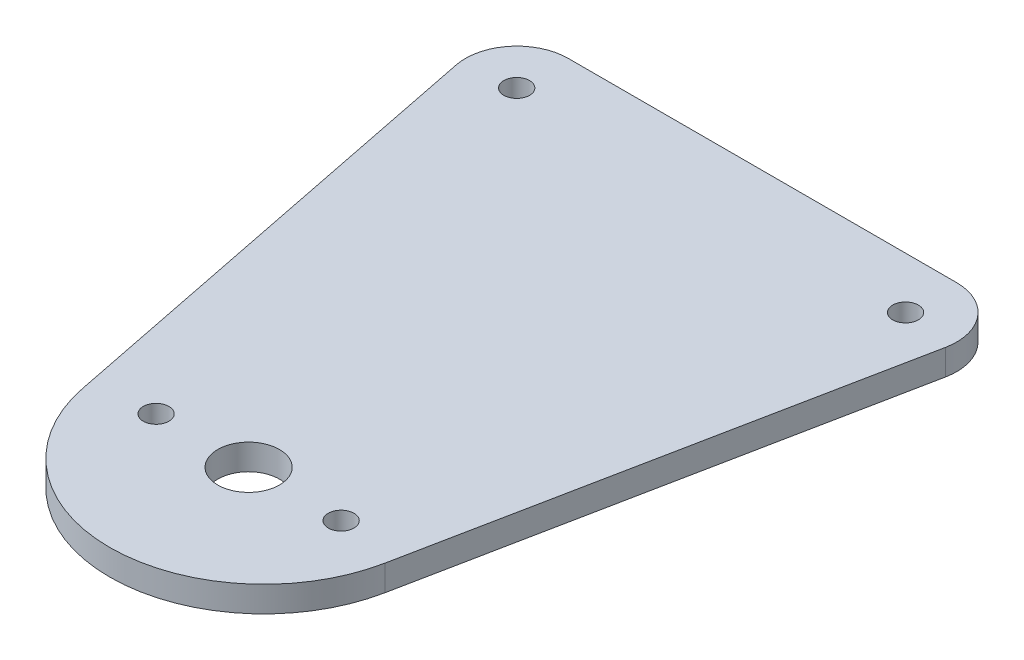
ISO-10303-21;
HEADER;
FILE_DESCRIPTION(('STEP AP214'),'2;1');
FILE_NAME('part.step','',(''),(''),'','','');
FILE_SCHEMA(('AUTOMOTIVE_DESIGN { 1 0 10303 214 1 1 1 1 }'));
ENDSEC;
DATA;
#1=APPLICATION_CONTEXT('core data for automotive mechanical design processes');
#2=APPLICATION_PROTOCOL_DEFINITION('international standard','automotive_design',2000,#1);
#3=PRODUCT_CONTEXT('',#1,'mechanical');
#4=PRODUCT('Part','Part','',(#3));
#5=PRODUCT_RELATED_PRODUCT_CATEGORY('part','',(#4));
#6=PRODUCT_DEFINITION_FORMATION('','',#4);
#7=PRODUCT_DEFINITION_CONTEXT('part definition',#1,'design');
#8=PRODUCT_DEFINITION('design','',#6,#7);
#9=PRODUCT_DEFINITION_SHAPE('','',#8);
#10=(LENGTH_UNIT() NAMED_UNIT(*) SI_UNIT(.MILLI.,.METRE.));
#11=(NAMED_UNIT(*) PLANE_ANGLE_UNIT() SI_UNIT($,.RADIAN.));
#12=(NAMED_UNIT(*) SI_UNIT($,.STERADIAN.) SOLID_ANGLE_UNIT());
#13=UNCERTAINTY_MEASURE_WITH_UNIT(LENGTH_MEASURE(1.E-05),#10,'distance_accuracy_value','');
#14=(GEOMETRIC_REPRESENTATION_CONTEXT(3) GLOBAL_UNCERTAINTY_ASSIGNED_CONTEXT((#13)) GLOBAL_UNIT_ASSIGNED_CONTEXT((#10,
#11,#12)) REPRESENTATION_CONTEXT('',''));
#15=CARTESIAN_POINT('',(0.,0.,0.));
#16=DIRECTION('',(0.,0.,1.));
#17=DIRECTION('',(1.,0.,0.));
#18=AXIS2_PLACEMENT_3D('',#15,#16,#17);
#19=CARTESIAN_POINT('',(-12.17,5.,-81.8380988672649));
#20=DIRECTION('',(0.,1.,0.));
#21=DIRECTION('',(0.,0.,1.));
#22=AXIS2_PLACEMENT_3D('',#19,#20,#21);
#23=PLANE('',#22);
#24=CARTESIAN_POINT('',(25.66,5.,-168.867513459481));
#25=DIRECTION('',(0.,1.,0.));
#26=DIRECTION('',(0.,0.,-1.));
#27=AXIS2_PLACEMENT_3D('',#24,#25,#26);
#28=CIRCLE('',#27,2.50000000000002);
#29=CARTESIAN_POINT('',(25.66,5.,-171.367513459481));
#30=VERTEX_POINT('',#29);
#31=EDGE_CURVE('E195',#30,#30,#28,.T.);
#32=ORIENTED_EDGE('',*,*,#31,.F.);
#33=EDGE_LOOP('',(#32));
#34=FACE_BOUND('',#33,.T.);
#35=CARTESIAN_POINT('',(5.82999999999994,5.,-78.8675134594814));
#36=DIRECTION('',(0.,1.,0.));
#37=DIRECTION('',(0.,0.,-1.));
#38=AXIS2_PLACEMENT_3D('',#35,#36,#37);
#39=CIRCLE('',#38,2.5);
#40=CARTESIAN_POINT('',(5.82999999999994,5.,-81.3675134594814));
#41=VERTEX_POINT('',#40);
#42=EDGE_CURVE('E207',#41,#41,#39,.T.);
#43=ORIENTED_EDGE('',*,*,#42,.F.);
#44=EDGE_LOOP('',(#43));
#45=FACE_BOUND('',#44,.T.);
#46=CARTESIAN_POINT('',(-12.17,5.,-81.8380988672649));
#47=DIRECTION('',(0.,1.,0.));
#48=DIRECTION('',(0.,0.,1.));
#49=AXIS2_PLACEMENT_3D('',#46,#47,#48);
#50=CIRCLE('',#49,30.);
#51=CARTESIAN_POINT('',(-41.5874202707276,5.,-75.9546148131194));
#52=VERTEX_POINT('',#51);
#53=CARTESIAN_POINT('',(17.2474202707275,5.,-75.9546148131194));
#54=VERTEX_POINT('',#53);
#55=EDGE_CURVE('E131',#52,#54,#50,.T.);
#56=ORIENTED_EDGE('',*,*,#55,.T.);
#57=DIRECTION('',(0.196116135138184,0.,-0.98058067569092));
#58=VECTOR('',#57,1.);
#59=CARTESIAN_POINT('',(17.2474202707275,5.,-75.9546148131194));
#60=LINE('',#59,#58);
#61=CARTESIAN_POINT('',(35.4377677297236,5.,-166.9063521081));
#62=VERTEX_POINT('',#61);
#63=EDGE_CURVE('E89',#54,#62,#60,.T.);
#64=ORIENTED_EDGE('',*,*,#63,.T.);
#65=CARTESIAN_POINT('',(25.6319609728144,5.,-168.867513459481));
#66=DIRECTION('',(0.,1.,0.));
#67=DIRECTION('',(0.,0.,-1.));
#68=AXIS2_PLACEMENT_3D('',#65,#66,#67);
#69=CIRCLE('',#68,9.99999999999999);
#70=CARTESIAN_POINT('',(25.6319609728144,5.,-178.867513459481));
#71=VERTEX_POINT('',#70);
#72=EDGE_CURVE('E102',#62,#71,#69,.T.);
#73=ORIENTED_EDGE('',*,*,#72,.T.);
#74=DIRECTION('',(-1.,0.,0.));
#75=VECTOR('',#74,1.);
#76=CARTESIAN_POINT('',(25.6319609728144,5.,-178.867513459481));
#77=LINE('',#76,#75);
#78=CARTESIAN_POINT('',(-49.9719609728145,5.,-178.867513459481));
#79=VERTEX_POINT('',#78);
#80=EDGE_CURVE('E96',#71,#79,#77,.T.);
#81=ORIENTED_EDGE('',*,*,#80,.T.);
#82=CARTESIAN_POINT('',(-49.9719609728145,5.,-168.867513459481));
#83=DIRECTION('',(0.,1.,0.));
#84=DIRECTION('',(0.,0.,1.));
#85=AXIS2_PLACEMENT_3D('',#82,#83,#84);
#86=CIRCLE('',#85,10.);
#87=CARTESIAN_POINT('',(-59.7777677297237,5.,-166.9063521081));
#88=VERTEX_POINT('',#87);
#89=EDGE_CURVE('E100',#79,#88,#86,.T.);
#90=ORIENTED_EDGE('',*,*,#89,.T.);
#91=DIRECTION('',(0.196116135138184,0.,0.98058067569092));
#92=VECTOR('',#91,1.);
#93=CARTESIAN_POINT('',(-59.7777677297237,5.,-166.9063521081));
#94=LINE('',#93,#92);
#95=EDGE_CURVE('E52',#88,#52,#94,.T.);
#96=ORIENTED_EDGE('',*,*,#95,.T.);
#97=EDGE_LOOP('',(#56,#64,#73,#81,#90,#96));
#98=FACE_BOUND('',#97,.T.);
#99=CARTESIAN_POINT('',(-30.1700000000001,5.,-78.8675134594814));
#100=DIRECTION('',(0.,1.,0.));
#101=DIRECTION('',(0.,0.,1.));
#102=AXIS2_PLACEMENT_3D('',#99,#100,#101);
#103=CIRCLE('',#102,2.5);
#104=CARTESIAN_POINT('',(-30.1700000000001,5.,-76.3675134594814));
#105=VERTEX_POINT('',#104);
#106=EDGE_CURVE('E124',#105,#105,#103,.T.);
#107=ORIENTED_EDGE('',*,*,#106,.F.);
#108=EDGE_LOOP('',(#107));
#109=FACE_BOUND('',#108,.T.);
#110=CARTESIAN_POINT('',(-50.0000000000001,5.,-168.867513459481));
#111=DIRECTION('',(0.,1.,0.));
#112=DIRECTION('',(0.,0.,1.));
#113=AXIS2_PLACEMENT_3D('',#110,#111,#112);
#114=CIRCLE('',#113,2.5);
#115=CARTESIAN_POINT('',(-50.0000000000001,5.,-166.367513459481));
#116=VERTEX_POINT('',#115);
#117=EDGE_CURVE('E201',#116,#116,#114,.T.);
#118=ORIENTED_EDGE('',*,*,#117,.F.);
#119=EDGE_LOOP('',(#118));
#120=FACE_BOUND('',#119,.T.);
#121=CARTESIAN_POINT('',(-12.17,5.,-78.8675134594814));
#122=DIRECTION('',(0.,1.,0.));
#123=DIRECTION('',(0.,0.,1.));
#124=AXIS2_PLACEMENT_3D('',#121,#122,#123);
#125=CIRCLE('',#124,6.);
#126=CARTESIAN_POINT('',(-12.17,5.,-72.8675134594814));
#127=VERTEX_POINT('',#126);
#128=EDGE_CURVE('E186',#127,#127,#125,.T.);
#129=ORIENTED_EDGE('',*,*,#128,.F.);
#130=EDGE_LOOP('',(#129));
#131=FACE_BOUND('',#130,.T.);
#132=ADVANCED_FACE('F35',(#34,#45,#98,#109,#120,#131),#23,.T.);
#133=CARTESIAN_POINT('',(-12.17,0.,-81.8380988672649));
#134=DIRECTION('',(0.,1.,0.));
#135=DIRECTION('',(0.,0.,1.));
#136=AXIS2_PLACEMENT_3D('',#133,#134,#135);
#137=PLANE('',#136);
#138=CARTESIAN_POINT('',(-12.17,0.,-81.8380988672649));
#139=DIRECTION('',(0.,1.,0.));
#140=DIRECTION('',(0.,0.,1.));
#141=AXIS2_PLACEMENT_3D('',#138,#139,#140);
#142=CIRCLE('',#141,30.);
#143=CARTESIAN_POINT('',(-41.5874202707276,0.,-75.9546148131194));
#144=VERTEX_POINT('',#143);
#145=CARTESIAN_POINT('',(17.2474202707275,0.,-75.9546148131194));
#146=VERTEX_POINT('',#145);
#147=EDGE_CURVE('E120',#144,#146,#142,.T.);
#148=ORIENTED_EDGE('',*,*,#147,.F.);
#149=DIRECTION('',(0.196116135138184,0.,0.98058067569092));
#150=VECTOR('',#149,1.);
#151=CARTESIAN_POINT('',(-59.7777677297237,0.,-166.9063521081));
#152=LINE('',#151,#150);
#153=CARTESIAN_POINT('',(-59.7777677297237,0.,-166.9063521081));
#154=VERTEX_POINT('',#153);
#155=EDGE_CURVE('E81',#154,#144,#152,.T.);
#156=ORIENTED_EDGE('',*,*,#155,.F.);
#157=CARTESIAN_POINT('',(-49.9719609728145,0.,-168.867513459481));
#158=DIRECTION('',(0.,1.,0.));
#159=DIRECTION('',(0.,0.,1.));
#160=AXIS2_PLACEMENT_3D('',#157,#158,#159);
#161=CIRCLE('',#160,10.);
#162=CARTESIAN_POINT('',(-49.9719609728145,0.,-178.867513459481));
#163=VERTEX_POINT('',#162);
#164=EDGE_CURVE('E75',#163,#154,#161,.T.);
#165=ORIENTED_EDGE('',*,*,#164,.F.);
#166=DIRECTION('',(-1.,0.,0.));
#167=VECTOR('',#166,1.);
#168=CARTESIAN_POINT('',(25.6319609728144,0.,-178.867513459481));
#169=LINE('',#168,#167);
#170=CARTESIAN_POINT('',(25.6319609728144,0.,-178.867513459481));
#171=VERTEX_POINT('',#170);
#172=EDGE_CURVE('E110',#171,#163,#169,.T.);
#173=ORIENTED_EDGE('',*,*,#172,.F.);
#174=CARTESIAN_POINT('',(25.6319609728144,0.,-168.867513459481));
#175=DIRECTION('',(0.,1.,0.));
#176=DIRECTION('',(0.,0.,-1.));
#177=AXIS2_PLACEMENT_3D('',#174,#175,#176);
#178=CIRCLE('',#177,9.99999999999999);
#179=CARTESIAN_POINT('',(35.4377677297236,0.,-166.9063521081));
#180=VERTEX_POINT('',#179);
#181=EDGE_CURVE('E126',#180,#171,#178,.T.);
#182=ORIENTED_EDGE('',*,*,#181,.F.);
#183=DIRECTION('',(0.196116135138184,0.,-0.98058067569092));
#184=VECTOR('',#183,1.);
#185=CARTESIAN_POINT('',(17.2474202707275,0.,-75.9546148131194));
#186=LINE('',#185,#184);
#187=EDGE_CURVE('E123',#146,#180,#186,.T.);
#188=ORIENTED_EDGE('',*,*,#187,.F.);
#189=EDGE_LOOP('',(#148,#156,#165,#173,#182,#188));
#190=FACE_BOUND('',#189,.T.);
#191=CARTESIAN_POINT('',(-30.1700000000001,0.,-78.8675134594814));
#192=DIRECTION('',(0.,1.,0.));
#193=DIRECTION('',(0.,0.,1.));
#194=AXIS2_PLACEMENT_3D('',#191,#192,#193);
#195=CIRCLE('',#194,2.5);
#196=CARTESIAN_POINT('',(-30.1700000000001,0.,-76.3675134594814));
#197=VERTEX_POINT('',#196);
#198=EDGE_CURVE('E210',#197,#197,#195,.T.);
#199=ORIENTED_EDGE('',*,*,#198,.T.);
#200=EDGE_LOOP('',(#199));
#201=FACE_BOUND('',#200,.T.);
#202=CARTESIAN_POINT('',(5.82999999999994,0.,-78.8675134594814));
#203=DIRECTION('',(0.,1.,0.));
#204=DIRECTION('',(0.,0.,-1.));
#205=AXIS2_PLACEMENT_3D('',#202,#203,#204);
#206=CIRCLE('',#205,2.5);
#207=CARTESIAN_POINT('',(5.82999999999994,0.,-81.3675134594814));
#208=VERTEX_POINT('',#207);
#209=EDGE_CURVE('E204',#208,#208,#206,.T.);
#210=ORIENTED_EDGE('',*,*,#209,.T.);
#211=EDGE_LOOP('',(#210));
#212=FACE_BOUND('',#211,.T.);
#213=CARTESIAN_POINT('',(-50.0000000000001,0.,-168.867513459481));
#214=DIRECTION('',(0.,1.,0.));
#215=DIRECTION('',(0.,0.,1.));
#216=AXIS2_PLACEMENT_3D('',#213,#214,#215);
#217=CIRCLE('',#216,2.5);
#218=CARTESIAN_POINT('',(-50.0000000000001,0.,-166.367513459481));
#219=VERTEX_POINT('',#218);
#220=EDGE_CURVE('E198',#219,#219,#217,.T.);
#221=ORIENTED_EDGE('',*,*,#220,.T.);
#222=EDGE_LOOP('',(#221));
#223=FACE_BOUND('',#222,.T.);
#224=CARTESIAN_POINT('',(25.66,0.,-168.867513459481));
#225=DIRECTION('',(0.,1.,0.));
#226=DIRECTION('',(0.,0.,-1.));
#227=AXIS2_PLACEMENT_3D('',#224,#225,#226);
#228=CIRCLE('',#227,2.50000000000002);
#229=CARTESIAN_POINT('',(25.66,0.,-171.367513459481));
#230=VERTEX_POINT('',#229);
#231=EDGE_CURVE('E192',#230,#230,#228,.T.);
#232=ORIENTED_EDGE('',*,*,#231,.T.);
#233=EDGE_LOOP('',(#232));
#234=FACE_BOUND('',#233,.T.);
#235=CARTESIAN_POINT('',(-12.17,0.,-78.8675134594814));
#236=DIRECTION('',(0.,1.,0.));
#237=DIRECTION('',(0.,0.,1.));
#238=AXIS2_PLACEMENT_3D('',#235,#236,#237);
#239=CIRCLE('',#238,6.);
#240=CARTESIAN_POINT('',(-12.17,0.,-72.8675134594814));
#241=VERTEX_POINT('',#240);
#242=EDGE_CURVE('E189',#241,#241,#239,.T.);
#243=ORIENTED_EDGE('',*,*,#242,.T.);
#244=EDGE_LOOP('',(#243));
#245=FACE_BOUND('',#244,.T.);
#246=ADVANCED_FACE('F140',(#190,#201,#212,#223,#234,#245),#137,.F.);
#247=CARTESIAN_POINT('',(-12.17,5.,-81.8380988672649));
#248=DIRECTION('',(0.,-1.,0.));
#249=DIRECTION('',(0.,0.,-1.));
#250=AXIS2_PLACEMENT_3D('',#247,#248,#249);
#251=CYLINDRICAL_SURFACE('',#250,30.);
#252=ORIENTED_EDGE('',*,*,#147,.T.);
#253=DIRECTION('',(0.,-1.,0.));
#254=VECTOR('',#253,1.);
#255=CARTESIAN_POINT('',(17.2474202707275,5.,-75.9546148131194));
#256=LINE('',#255,#254);
#257=EDGE_CURVE('E11',#54,#146,#256,.T.);
#258=ORIENTED_EDGE('',*,*,#257,.F.);
#259=ORIENTED_EDGE('',*,*,#55,.F.);
#260=DIRECTION('',(0.,-1.,0.));
#261=VECTOR('',#260,1.);
#262=CARTESIAN_POINT('',(-41.5874202707276,5.,-75.9546148131194));
#263=LINE('',#262,#261);
#264=EDGE_CURVE('E116',#52,#144,#263,.T.);
#265=ORIENTED_EDGE('',*,*,#264,.T.);
#266=EDGE_LOOP('',(#252,#258,#259,#265));
#267=FACE_BOUND('',#266,.T.);
#268=ADVANCED_FACE('F37',(#267),#251,.T.);
#269=CARTESIAN_POINT('',(17.2474202707275,5.,-75.9546148131194));
#270=DIRECTION('',(-0.98058067569092,0.,-0.196116135138184));
#271=DIRECTION('',(-0.196116135138184,0.,0.98058067569092));
#272=AXIS2_PLACEMENT_3D('',#269,#270,#271);
#273=PLANE('',#272);
#274=ORIENTED_EDGE('',*,*,#187,.T.);
#275=DIRECTION('',(0.,-1.,0.));
#276=VECTOR('',#275,1.);
#277=CARTESIAN_POINT('',(35.4377677297236,5.,-166.9063521081));
#278=LINE('',#277,#276);
#279=EDGE_CURVE('E44',#62,#180,#278,.T.);
#280=ORIENTED_EDGE('',*,*,#279,.F.);
#281=ORIENTED_EDGE('',*,*,#63,.F.);
#282=ORIENTED_EDGE('',*,*,#257,.T.);
#283=EDGE_LOOP('',(#274,#280,#281,#282));
#284=FACE_BOUND('',#283,.T.);
#285=ADVANCED_FACE('F277',(#284),#273,.F.);
#286=CARTESIAN_POINT('',(25.6319609728144,5.,-168.867513459481));
#287=DIRECTION('',(0.,-1.,0.));
#288=DIRECTION('',(0.,0.,-1.));
#289=AXIS2_PLACEMENT_3D('',#286,#287,#288);
#290=CYLINDRICAL_SURFACE('',#289,9.99999999999999);
#291=ORIENTED_EDGE('',*,*,#181,.T.);
#292=DIRECTION('',(0.,-1.,0.));
#293=VECTOR('',#292,1.);
#294=CARTESIAN_POINT('',(25.6319609728144,5.,-178.867513459481));
#295=LINE('',#294,#293);
#296=EDGE_CURVE('E111',#71,#171,#295,.T.);
#297=ORIENTED_EDGE('',*,*,#296,.F.);
#298=ORIENTED_EDGE('',*,*,#72,.F.);
#299=ORIENTED_EDGE('',*,*,#279,.T.);
#300=EDGE_LOOP('',(#291,#297,#298,#299));
#301=FACE_BOUND('',#300,.T.);
#302=ADVANCED_FACE('F137',(#301),#290,.T.);
#303=CARTESIAN_POINT('',(25.6319609728144,5.,-178.867513459481));
#304=DIRECTION('',(0.,0.,1.));
#305=DIRECTION('',(1.,0.,0.));
#306=AXIS2_PLACEMENT_3D('',#303,#304,#305);
#307=PLANE('',#306);
#308=ORIENTED_EDGE('',*,*,#172,.T.);
#309=DIRECTION('',(0.,-1.,0.));
#310=VECTOR('',#309,1.);
#311=CARTESIAN_POINT('',(-49.9719609728145,5.,-178.867513459481));
#312=LINE('',#311,#310);
#313=EDGE_CURVE('E107',#79,#163,#312,.T.);
#314=ORIENTED_EDGE('',*,*,#313,.F.);
#315=ORIENTED_EDGE('',*,*,#80,.F.);
#316=ORIENTED_EDGE('',*,*,#296,.T.);
#317=EDGE_LOOP('',(#308,#314,#315,#316));
#318=FACE_BOUND('',#317,.T.);
#319=ADVANCED_FACE('F108',(#318),#307,.F.);
#320=CARTESIAN_POINT('',(-49.9719609728145,5.,-168.867513459481));
#321=DIRECTION('',(0.,-1.,0.));
#322=DIRECTION('',(0.,0.,-1.));
#323=AXIS2_PLACEMENT_3D('',#320,#321,#322);
#324=CYLINDRICAL_SURFACE('',#323,10.);
#325=ORIENTED_EDGE('',*,*,#164,.T.);
#326=DIRECTION('',(0.,-1.,0.));
#327=VECTOR('',#326,1.);
#328=CARTESIAN_POINT('',(-59.7777677297237,5.,-166.9063521081));
#329=LINE('',#328,#327);
#330=EDGE_CURVE('E112',#88,#154,#329,.T.);
#331=ORIENTED_EDGE('',*,*,#330,.F.);
#332=ORIENTED_EDGE('',*,*,#89,.F.);
#333=ORIENTED_EDGE('',*,*,#313,.T.);
#334=EDGE_LOOP('',(#325,#331,#332,#333));
#335=FACE_BOUND('',#334,.T.);
#336=ADVANCED_FACE('F114',(#335),#324,.T.);
#337=CARTESIAN_POINT('',(-59.7777677297237,5.,-166.9063521081));
#338=DIRECTION('',(0.98058067569092,0.,-0.196116135138184));
#339=DIRECTION('',(-0.196116135138184,0.,-0.98058067569092));
#340=AXIS2_PLACEMENT_3D('',#337,#338,#339);
#341=PLANE('',#340);
#342=ORIENTED_EDGE('',*,*,#155,.T.);
#343=ORIENTED_EDGE('',*,*,#264,.F.);
#344=ORIENTED_EDGE('',*,*,#95,.F.);
#345=ORIENTED_EDGE('',*,*,#330,.T.);
#346=EDGE_LOOP('',(#342,#343,#344,#345));
#347=FACE_BOUND('',#346,.T.);
#348=ADVANCED_FACE('F145',(#347),#341,.F.);
#349=CARTESIAN_POINT('',(-30.1700000000001,5.,-78.8675134594814));
#350=DIRECTION('',(0.,-1.,0.));
#351=DIRECTION('',(0.,0.,-1.));
#352=AXIS2_PLACEMENT_3D('',#349,#350,#351);
#353=CYLINDRICAL_SURFACE('',#352,2.5);
#354=ORIENTED_EDGE('',*,*,#106,.T.);
#355=EDGE_LOOP('',(#354));
#356=FACE_BOUND('',#355,.T.);
#357=ORIENTED_EDGE('',*,*,#198,.F.);
#358=EDGE_LOOP('',(#357));
#359=FACE_BOUND('',#358,.T.);
#360=ADVANCED_FACE('F147',(#356,#359),#353,.F.);
#361=CARTESIAN_POINT('',(5.82999999999994,5.,-78.8675134594814));
#362=DIRECTION('',(0.,-1.,0.));
#363=DIRECTION('',(0.,0.,-1.));
#364=AXIS2_PLACEMENT_3D('',#361,#362,#363);
#365=CYLINDRICAL_SURFACE('',#364,2.5);
#366=ORIENTED_EDGE('',*,*,#42,.T.);
#367=EDGE_LOOP('',(#366));
#368=FACE_BOUND('',#367,.T.);
#369=ORIENTED_EDGE('',*,*,#209,.F.);
#370=EDGE_LOOP('',(#369));
#371=FACE_BOUND('',#370,.T.);
#372=ADVANCED_FACE('F153',(#368,#371),#365,.F.);
#373=CARTESIAN_POINT('',(-50.0000000000001,5.,-168.867513459481));
#374=DIRECTION('',(0.,-1.,0.));
#375=DIRECTION('',(0.,0.,-1.));
#376=AXIS2_PLACEMENT_3D('',#373,#374,#375);
#377=CYLINDRICAL_SURFACE('',#376,2.5);
#378=ORIENTED_EDGE('',*,*,#117,.T.);
#379=EDGE_LOOP('',(#378));
#380=FACE_BOUND('',#379,.T.);
#381=ORIENTED_EDGE('',*,*,#220,.F.);
#382=EDGE_LOOP('',(#381));
#383=FACE_BOUND('',#382,.T.);
#384=ADVANCED_FACE('F169',(#380,#383),#377,.F.);
#385=CARTESIAN_POINT('',(25.66,5.,-168.867513459481));
#386=DIRECTION('',(0.,-1.,0.));
#387=DIRECTION('',(0.,0.,-1.));
#388=AXIS2_PLACEMENT_3D('',#385,#386,#387);
#389=CYLINDRICAL_SURFACE('',#388,2.50000000000002);
#390=ORIENTED_EDGE('',*,*,#31,.T.);
#391=EDGE_LOOP('',(#390));
#392=FACE_BOUND('',#391,.T.);
#393=ORIENTED_EDGE('',*,*,#231,.F.);
#394=EDGE_LOOP('',(#393));
#395=FACE_BOUND('',#394,.T.);
#396=ADVANCED_FACE('F173',(#392,#395),#389,.F.);
#397=CARTESIAN_POINT('',(-12.17,5.,-78.8675134594814));
#398=DIRECTION('',(0.,-1.,0.));
#399=DIRECTION('',(0.,0.,-1.));
#400=AXIS2_PLACEMENT_3D('',#397,#398,#399);
#401=CYLINDRICAL_SURFACE('',#400,6.);
#402=ORIENTED_EDGE('',*,*,#128,.T.);
#403=EDGE_LOOP('',(#402));
#404=FACE_BOUND('',#403,.T.);
#405=ORIENTED_EDGE('',*,*,#242,.F.);
#406=EDGE_LOOP('',(#405));
#407=FACE_BOUND('',#406,.T.);
#408=ADVANCED_FACE('F177',(#404,#407),#401,.F.);
#409=CLOSED_SHELL('',(#132,#246,#268,#285,#302,#319,#336,#348,#360,#372,#384,#396,#408));
#410=MANIFOLD_SOLID_BREP('B2',#409);
#411=ADVANCED_BREP_SHAPE_REPRESENTATION('',(#18,#410),#14);
#412=SHAPE_DEFINITION_REPRESENTATION(#9,#411);
ENDSEC;
END-ISO-10303-21;
